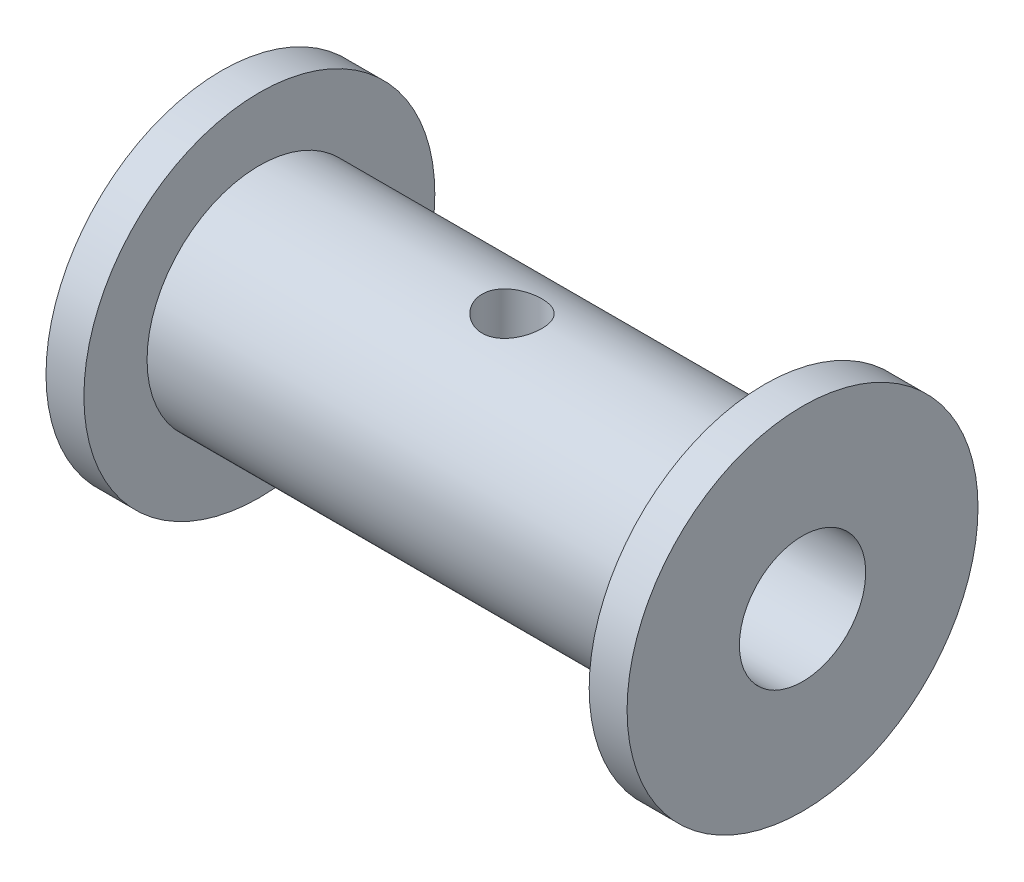
ISO-10303-21;
HEADER;
FILE_DESCRIPTION(('STEP AP214'),'2;1');
FILE_NAME('part.step','',(''),(''),'','','');
FILE_SCHEMA(('AUTOMOTIVE_DESIGN { 1 0 10303 214 1 1 1 1 }'));
ENDSEC;
DATA;
#1=APPLICATION_CONTEXT('core data for automotive mechanical design processes');
#2=APPLICATION_PROTOCOL_DEFINITION('international standard','automotive_design',2000,#1);
#3=PRODUCT_CONTEXT('',#1,'mechanical');
#4=PRODUCT('Part','Part','',(#3));
#5=PRODUCT_RELATED_PRODUCT_CATEGORY('part','',(#4));
#6=PRODUCT_DEFINITION_FORMATION('','',#4);
#7=PRODUCT_DEFINITION_CONTEXT('part definition',#1,'design');
#8=PRODUCT_DEFINITION('design','',#6,#7);
#9=PRODUCT_DEFINITION_SHAPE('','',#8);
#10=(LENGTH_UNIT() NAMED_UNIT(*) SI_UNIT(.MILLI.,.METRE.));
#11=(NAMED_UNIT(*) PLANE_ANGLE_UNIT() SI_UNIT($,.RADIAN.));
#12=(NAMED_UNIT(*) SI_UNIT($,.STERADIAN.) SOLID_ANGLE_UNIT());
#13=UNCERTAINTY_MEASURE_WITH_UNIT(LENGTH_MEASURE(1.E-05),#10,'distance_accuracy_value','');
#14=(GEOMETRIC_REPRESENTATION_CONTEXT(3) GLOBAL_UNCERTAINTY_ASSIGNED_CONTEXT((#13)) GLOBAL_UNIT_ASSIGNED_CONTEXT((#10,
#11,#12)) REPRESENTATION_CONTEXT('',''));
#15=CARTESIAN_POINT('',(0.,0.,0.));
#16=DIRECTION('',(0.,0.,1.));
#17=DIRECTION('',(1.,0.,0.));
#18=AXIS2_PLACEMENT_3D('',#15,#16,#17);
#19=CARTESIAN_POINT('',(-15.2755244755245,0.,0.));
#20=DIRECTION('',(-1.,0.,0.));
#21=DIRECTION('',(0.,0.,1.));
#22=AXIS2_PLACEMENT_3D('',#19,#20,#21);
#23=CYLINDRICAL_SURFACE('',#22,3.175);
#24=CARTESIAN_POINT('',(14.605,0.,0.));
#25=DIRECTION('',(-1.,0.,0.));
#26=DIRECTION('',(0.,0.,1.));
#27=AXIS2_PLACEMENT_3D('',#24,#25,#26);
#28=CIRCLE('',#27,3.175);
#29=CARTESIAN_POINT('',(14.605,0.,3.175));
#30=VERTEX_POINT('',#29);
#31=EDGE_CURVE('E80',#30,#30,#28,.T.);
#32=ORIENTED_EDGE('',*,*,#31,.F.);
#33=EDGE_LOOP('',(#32));
#34=FACE_BOUND('',#33,.T.);
#35=CARTESIAN_POINT('',(-14.605,0.,0.));
#36=DIRECTION('',(-1.,0.,0.));
#37=DIRECTION('',(0.,0.,1.));
#38=AXIS2_PLACEMENT_3D('',#35,#36,#37);
#39=CIRCLE('',#38,3.175);
#40=CARTESIAN_POINT('',(-14.605,0.,3.175));
#41=VERTEX_POINT('',#40);
#42=EDGE_CURVE('E74',#41,#41,#39,.T.);
#43=ORIENTED_EDGE('',*,*,#42,.T.);
#44=EDGE_LOOP('',(#43));
#45=FACE_BOUND('',#44,.T.);
#46=CARTESIAN_POINT('',(0.,2.7983253920872,-1.5));
#47=CARTESIAN_POINT('',(0.0788107476010317,2.79833097649977,-1.49999523547047));
#48=CARTESIAN_POINT('',(0.157735612205732,2.80170427159323,-1.49374832449328));
#49=CARTESIAN_POINT('',(0.313214667514685,2.81472644561665,-1.4690554061353));
#50=CARTESIAN_POINT('',(0.389762907162894,2.82438992585351,-1.45058101361493));
#51=CARTESIAN_POINT('',(0.537952673756733,2.84863009396432,-1.40237253355636));
#52=CARTESIAN_POINT('',(0.609616136431819,2.86318279906116,-1.37269332197988));
#53=CARTESIAN_POINT('',(0.74692939284759,2.89552502377023,-1.30308399064543));
#54=CARTESIAN_POINT('',(0.8125794422789,2.91331440566267,-1.26315430701281));
#55=CARTESIAN_POINT('',(0.941323245258398,2.95172227722859,-1.1707430871524));
#56=CARTESIAN_POINT('',(1.00387788849068,2.97245254188493,-1.11755658650795));
#57=CARTESIAN_POINT('',(1.11959143684936,3.01349951044786,-1.00161259672222));
#58=CARTESIAN_POINT('',(1.17274606260041,3.03381602228766,-0.938850772491945));
#59=CARTESIAN_POINT('',(1.27118937954777,3.07317288716969,-0.801034900704515));
#60=CARTESIAN_POINT('',(1.31583450125175,3.09206866660246,-0.725476017233364));
#61=CARTESIAN_POINT('',(1.39153752206176,3.12503381595021,-0.566861686619154));
#62=CARTESIAN_POINT('',(1.42260309774527,3.13910591174128,-0.483810507023549));
#63=CARTESIAN_POINT('',(1.46819431985617,3.16003750546179,-0.318263833167133));
#64=CARTESIAN_POINT('',(1.4836598006004,3.16730464125021,-0.23607983759682));
#65=CARTESIAN_POINT('',(1.50068669846295,3.17531500926786,-0.0699854874354078));
#66=CARTESIAN_POINT('',(1.50225551712034,3.17606171435844,0.0139239243031286));
#67=CARTESIAN_POINT('',(1.49185310738046,3.1711569999128,0.17410404695592));
#68=CARTESIAN_POINT('',(1.4809263684281,3.16599910390162,0.250460926307549));
#69=CARTESIAN_POINT('',(1.44768451199486,3.15058713309443,0.400106757592313));
#70=CARTESIAN_POINT('',(1.42536854800002,3.14033267949386,0.473395481043944));
#71=CARTESIAN_POINT('',(1.36978180811971,3.11549383971164,0.61616215999247));
#72=CARTESIAN_POINT('',(1.33635400002596,3.10084769916082,0.685567785451937));
#73=CARTESIAN_POINT('',(1.25968096352203,3.06858481389696,0.817962218284119));
#74=CARTESIAN_POINT('',(1.21643213988174,3.05096698193041,0.880948663490016));
#75=CARTESIAN_POINT('',(1.11701776567009,3.01265189942243,1.00453666893054));
#76=CARTESIAN_POINT('',(1.06005736803148,2.9918200943109,1.0644578414785));
#77=CARTESIAN_POINT('',(0.93699705964444,2.95046283361779,1.17424124933889));
#78=CARTESIAN_POINT('',(0.87089145595116,2.92993757775203,1.2240971710571));
#79=CARTESIAN_POINT('',(0.727172138151077,2.89039711066438,1.31484174230845));
#80=CARTESIAN_POINT('',(0.649138941996297,2.87151577260243,1.35512986365461));
#81=CARTESIAN_POINT('',(0.486283743531031,2.83914834140001,1.42170562946273));
#82=CARTESIAN_POINT('',(0.401468219875632,2.82565717160027,1.44800645544408));
#83=CARTESIAN_POINT('',(0.234253704737598,2.80697974613979,1.48387059914899));
#84=CARTESIAN_POINT('',(0.152157558069844,2.80124227464673,1.4945499135996));
#85=CARTESIAN_POINT('',(-0.0128364544628812,2.79714234532468,1.50221328025957));
#86=CARTESIAN_POINT('',(-0.0957338532268694,2.79877582206013,1.49920488189903));
#87=CARTESIAN_POINT('',(-0.25184110118071,2.80865284380239,1.4806017347564));
#88=CARTESIAN_POINT('',(-0.32523813353968,2.81627144126264,1.46619608896935));
#89=CARTESIAN_POINT('',(-0.468463633051388,2.83637948512089,1.42690562153975));
#90=CARTESIAN_POINT('',(-0.538291075738513,2.8488703210638,1.40201781025962));
#91=CARTESIAN_POINT('',(-0.676035807524976,2.87800314814948,1.3412324594274));
#92=CARTESIAN_POINT('',(-0.743715994140066,2.89481019393091,1.30487958898417));
#93=CARTESIAN_POINT('',(-0.872389828600745,2.93050507850425,1.22260967416881));
#94=CARTESIAN_POINT('',(-0.93338011780599,2.94939395301752,1.17668785898318));
#95=CARTESIAN_POINT('',(-1.05395122429284,2.98962533435876,1.07066250220429));
#96=CARTESIAN_POINT('',(-1.11263900919066,3.0110091844446,1.00955462247668));
#97=CARTESIAN_POINT('',(-1.2191662131219,3.05197816465585,0.877952835832725));
#98=CARTESIAN_POINT('',(-1.26700313884629,3.07156288076261,0.807456777596013));
#99=CARTESIAN_POINT('',(-1.35106340432696,3.10717258491727,0.657374049291596));
#100=CARTESIAN_POINT('',(-1.38708244177874,3.12313361565429,0.577656753882327));
#101=CARTESIAN_POINT('',(-1.44486593502356,3.14922093597641,0.412327293299583));
#102=CARTESIAN_POINT('',(-1.46664154231209,3.15935178938716,0.326719797872878));
#103=CARTESIAN_POINT('',(-1.49363889435459,3.17197971044583,0.159896332874223));
#104=CARTESIAN_POINT('',(-1.50011013632642,3.17505233840112,0.078925398284078));
#105=CARTESIAN_POINT('',(-1.49988711965684,3.17494636529876,-0.0829833461657175));
#106=CARTESIAN_POINT('',(-1.49319653511093,3.17176950877122,-0.163921158963004));
#107=CARTESIAN_POINT('',(-1.46770848023088,3.15985410378094,-0.318841842835547));
#108=CARTESIAN_POINT('',(-1.44959197491994,3.15142868675494,-0.392963167600614));
#109=CARTESIAN_POINT('',(-1.40262108547478,3.13010132928976,-0.537026434022491));
#110=CARTESIAN_POINT('',(-1.37376499240882,3.1171986764347,-0.60696770847403));
#111=CARTESIAN_POINT('',(-1.30473490189286,3.08738510301285,-0.744198443618439));
#112=CARTESIAN_POINT('',(-1.26410939390821,3.0703197298679,-0.811226286131094));
#113=CARTESIAN_POINT('',(-1.17328432091972,3.03405477724481,-0.937805412907553));
#114=CARTESIAN_POINT('',(-1.12308040855481,3.01485423033003,-0.997353281796323));
#115=CARTESIAN_POINT('',(-1.00928446778082,2.97425749382228,-1.11287613406119));
#116=CARTESIAN_POINT('',(-0.944896373173603,2.9528185885393,-1.16805442942683));
#117=CARTESIAN_POINT('',(-0.807312145748489,2.91171333700677,-1.26705651381277));
#118=CARTESIAN_POINT('',(-0.734109598744511,2.89204830000693,-1.31087196019013));
#119=CARTESIAN_POINT('',(-0.579232422210802,2.85663554941127,-1.3863737982034));
#120=CARTESIAN_POINT('',(-0.497439352525226,2.84095675906997,-1.41785130272302));
#121=CARTESIAN_POINT('',(-0.328811998329219,2.81635628214136,-1.4661232120466));
#122=CARTESIAN_POINT('',(-0.241995696672077,2.80741192483264,-1.48296690968124));
#123=CARTESIAN_POINT('',(-0.128694633247988,2.80116429672363,-1.49469268672873));
#124=CARTESIAN_POINT('',(-0.10301180774758,2.80010260103933,-1.49668048940514));
#125=CARTESIAN_POINT('',(-0.0515567295081782,2.79868221732461,-1.49933495903092));
#126=CARTESIAN_POINT('',(-0.0257844722890938,2.79832356503778,-1.50000155880871));
#127=CARTESIAN_POINT('',(0.,2.7983253920872,-1.5));
#128=B_SPLINE_CURVE_WITH_KNOTS('',3,(#46,#47,#48,#49,#50,#51,#52,#53,#54,#55,#56,#57,#58,#59,
#60,#61,#62,#63,#64,#65,#66,#67,#68,#69,#70,#71,#72,#73,#74,#75,#76,#77,#78,#79,#80,#81,#82,#83,
#84,#85,#86,#87,#88,#89,#90,#91,#92,#93,#94,#95,#96,#97,#98,#99,#100,#101,#102,#103,#104,#105,
#106,#107,#108,#109,#110,#111,#112,#113,#114,#115,#116,#117,#118,#119,#120,#121,#122,#123,#124,
#125,#126,#127),.UNSPECIFIED.,.T.,.F.,(4,2,2,2,2,2,2,2,2,2,2,2,2,2,2,2,2,2,2,2,2,2,2,2,2,2,2,2,
2,2,2,2,2,2,2,2,2,2,2,2,4),(0.,0.236323871838544,0.473198284289302,0.708927337380699,
0.944646362603916,1.19762429635865,1.45071710395354,1.71864285343498,1.98641694681215,
2.23687152724756,2.48719270436037,2.71802817018661,2.94888079555674,3.1831453100556,
3.41749572162706,3.67216706074964,3.92699765369087,4.19506898546716,4.46288723920479,
4.71043828617548,4.95785281342715,5.18239796950746,5.40700721193729,5.64198832122139,
5.87708686716682,6.13804637958085,6.39906579463174,6.66438519401193,6.92949661955738,
7.17207877892644,7.41459323161728,7.64386670961211,7.87317668624822,8.11282240294707,
8.35257714778319,8.61378861881715,8.87519133270404,9.14084608292566,9.40560248746477,
9.48291651801969,9.56023447921351),.UNSPECIFIED.);
#129=CARTESIAN_POINT('',(0.,2.7983253920872,-1.5));
#130=VERTEX_POINT('',#129);
#131=EDGE_CURVE('E100',#130,#130,#128,.T.);
#132=ORIENTED_EDGE('',*,*,#131,.F.);
#133=EDGE_LOOP('',(#132));
#134=FACE_BOUND('',#133,.T.);
#135=ADVANCED_FACE('F55',(#34,#45,#134),#23,.F.);
#136=CARTESIAN_POINT('',(-15.2755244755245,0.,0.));
#137=DIRECTION('',(-1.,0.,0.));
#138=DIRECTION('',(0.,0.,1.));
#139=AXIS2_PLACEMENT_3D('',#136,#137,#138);
#140=CYLINDRICAL_SURFACE('',#139,5.64515);
#141=CARTESIAN_POINT('',(-12.7,0.,0.));
#142=DIRECTION('',(-1.,0.,0.));
#143=DIRECTION('',(0.,0.,1.));
#144=AXIS2_PLACEMENT_3D('',#141,#142,#143);
#145=CIRCLE('',#144,5.64515);
#146=CARTESIAN_POINT('',(-12.7,0.,5.64515));
#147=VERTEX_POINT('',#146);
#148=EDGE_CURVE('E96',#147,#147,#145,.T.);
#149=ORIENTED_EDGE('',*,*,#148,.F.);
#150=EDGE_LOOP('',(#149));
#151=FACE_BOUND('',#150,.T.);
#152=CARTESIAN_POINT('',(12.7,0.,0.));
#153=DIRECTION('',(-1.,0.,0.));
#154=DIRECTION('',(0.,0.,1.));
#155=AXIS2_PLACEMENT_3D('',#152,#153,#154);
#156=CIRCLE('',#155,5.64515);
#157=CARTESIAN_POINT('',(12.7,0.,5.64515));
#158=VERTEX_POINT('',#157);
#159=EDGE_CURVE('E92',#158,#158,#156,.T.);
#160=ORIENTED_EDGE('',*,*,#159,.T.);
#161=EDGE_LOOP('',(#160));
#162=FACE_BOUND('',#161,.T.);
#163=CARTESIAN_POINT('',(0.,5.44221632448583,-1.5));
#164=CARTESIAN_POINT('',(0.0826436498905731,5.44221776734982,-1.49999798482397));
#165=CARTESIAN_POINT('',(0.16530868542223,5.44411939956257,-1.49314675929322));
#166=CARTESIAN_POINT('',(0.328252175478541,5.45149790283637,-1.46597434045337));
#167=CARTESIAN_POINT('',(0.40852940000449,5.45697658425119,-1.4456463264267));
#168=CARTESIAN_POINT('',(0.564316549846696,5.47084585840447,-1.39223506110244));
#169=CARTESIAN_POINT('',(0.639832974686705,5.4792323749097,-1.35916965804295));
#170=CARTESIAN_POINT('',(0.784258298044925,5.49796717883473,-1.28127804023893));
#171=CARTESIAN_POINT('',(0.853166696174541,5.50831561464326,-1.23645093580583));
#172=CARTESIAN_POINT('',(0.984131351122835,5.53009622169304,-1.13511800376794));
#173=CARTESIAN_POINT('',(1.045999199762,5.54154749766791,-1.0783727299323));
#174=CARTESIAN_POINT('',(1.15946134412678,5.56407856754538,-0.95532926139728));
#175=CARTESIAN_POINT('',(1.21105458106165,5.57515832306535,-0.889030083387623));
#176=CARTESIAN_POINT('',(1.30328774666803,5.59591104111497,-0.747455285881688));
#177=CARTESIAN_POINT('',(1.34374049853005,5.6055588379263,-0.672053715192328));
#178=CARTESIAN_POINT('',(1.41132390215023,5.62214145846994,-0.515220536696469));
#179=CARTESIAN_POINT('',(1.43845678369634,5.62907673624688,-0.433789940796049));
#180=CARTESIAN_POINT('',(1.47802084117912,5.63931781333287,-0.269176674072655));
#181=CARTESIAN_POINT('',(1.4907724800169,5.64270260418738,-0.186076025421636));
#182=CARTESIAN_POINT('',(1.50222017877792,5.64573746281875,-0.0188506571242278));
#183=CARTESIAN_POINT('',(1.50091857507756,5.6453881513968,0.0652738899743704));
#184=CARTESIAN_POINT('',(1.48452268941679,5.64105209399141,0.229928980435986));
#185=CARTESIAN_POINT('',(1.46977462197647,5.63715665623427,0.310496770097809));
#186=CARTESIAN_POINT('',(1.42746360991348,5.62627370326876,0.46797007430665));
#187=CARTESIAN_POINT('',(1.39989993721051,5.61928601238435,0.544875380506924));
#188=CARTESIAN_POINT('',(1.33247392627963,5.60286801449619,0.69372614519827));
#189=CARTESIAN_POINT('',(1.29249269629158,5.5934142425149,0.765615053879316));
#190=CARTESIAN_POINT('',(1.20145768524585,5.57308308647157,0.901781568257522));
#191=CARTESIAN_POINT('',(1.15040175929234,5.56220542679961,0.966057695813074));
#192=CARTESIAN_POINT('',(1.03682773330209,5.53981441387915,1.08724045508485));
#193=CARTESIAN_POINT('',(0.974007640829174,5.52829179055745,1.14386267184279));
#194=CARTESIAN_POINT('',(0.839644289069423,5.50620898724192,1.2458374510173));
#195=CARTESIAN_POINT('',(0.768100506093186,5.49564886509427,1.29118933637082));
#196=CARTESIAN_POINT('',(0.617707356422072,5.47664977453883,1.36955056186863));
#197=CARTESIAN_POINT('',(0.538816186462395,5.46822410361388,1.40248312266783));
#198=CARTESIAN_POINT('',(0.376337254846516,5.45461343650754,1.45452478437216));
#199=CARTESIAN_POINT('',(0.292750653817778,5.44942764329396,1.47363728528923));
#200=CARTESIAN_POINT('',(0.125912172177079,5.44305353995125,1.49700705991464));
#201=CARTESIAN_POINT('',(0.0427239810357125,5.44175115881421,1.50168837778865));
#202=CARTESIAN_POINT('',(-0.1232464577724,5.44297933834186,1.4972307826834));
#203=CARTESIAN_POINT('',(-0.206028747366463,5.44550949438728,1.48809332861816));
#204=CARTESIAN_POINT('',(-0.367207135323571,5.4540075322859,1.45663127836107));
#205=CARTESIAN_POINT('',(-0.445656740300897,5.45990903142662,1.43456112068596));
#206=CARTESIAN_POINT('',(-0.597740886982624,5.47442006116055,1.37814600803546));
#207=CARTESIAN_POINT('',(-0.671374801748043,5.48302994350498,1.34379945858488));
#208=CARTESIAN_POINT('',(-0.813512813620183,5.50222211118877,1.26294408640984));
#209=CARTESIAN_POINT('',(-0.881869725769598,5.51284337226439,1.21618598741617));
#210=CARTESIAN_POINT('',(-1.00992272855403,5.53476961780604,1.11214416757658));
#211=CARTESIAN_POINT('',(-1.06961719942342,5.54607472958491,1.05485848273389));
#212=CARTESIAN_POINT('',(-1.18040859389798,5.56848722620232,0.929427134768067));
#213=CARTESIAN_POINT('',(-1.23120994588551,5.57957964884856,0.861017194964994));
#214=CARTESIAN_POINT('',(-1.32060764860309,5.599984167669,0.716394281042795));
#215=CARTESIAN_POINT('',(-1.3592046487608,5.60929635856387,0.640181722408612));
#216=CARTESIAN_POINT('',(-1.42274469648724,5.62503122537354,0.48265320991643));
#217=CARTESIAN_POINT('',(-1.44778951135348,5.63147537138664,0.40138055252435));
#218=CARTESIAN_POINT('',(-1.48381017839642,5.64084252840109,0.235583544296043));
#219=CARTESIAN_POINT('',(-1.49478912449133,5.64376631372989,0.151059912756287));
#220=CARTESIAN_POINT('',(-1.50217372513024,5.64572704476748,-0.0160774687073766));
#221=CARTESIAN_POINT('',(-1.49901309840769,5.64487967160035,-0.0986709709983087));
#222=CARTESIAN_POINT('',(-1.4792145259925,5.63965460646783,-0.262106269548189));
#223=CARTESIAN_POINT('',(-1.46257707990777,5.63527704537237,-0.342948130629297));
#224=CARTESIAN_POINT('',(-1.41654166905826,5.62350613840027,-0.500067594383635));
#225=CARTESIAN_POINT('',(-1.38723114573617,5.61613347874035,-0.576372469362012));
#226=CARTESIAN_POINT('',(-1.31675972779932,5.59914363493961,-0.723024835745982));
#227=CARTESIAN_POINT('',(-1.27559718045501,5.58952613779831,-0.793371494524248));
#228=CARTESIAN_POINT('',(-1.18131764645405,5.56875793134443,-0.928131965195986));
#229=CARTESIAN_POINT('',(-1.12791269922945,5.5575733380131,-0.992339082223208));
#230=CARTESIAN_POINT('',(-1.01121124142991,5.53506950879546,-1.1110269742205));
#231=CARTESIAN_POINT('',(-0.947912137560949,5.52375023833045,-1.16550519116753));
#232=CARTESIAN_POINT('',(-0.811559656990754,5.50197482997724,-1.2643635861029));
#233=CARTESIAN_POINT('',(-0.738323782610976,5.49154287549226,-1.30849784931156));
#234=CARTESIAN_POINT('',(-0.585203332164704,5.47306373496142,-1.38376439419231));
#235=CARTESIAN_POINT('',(-0.505323175756261,5.46501497964844,-1.41490523720545));
#236=CARTESIAN_POINT('',(-0.354773607905721,5.45333936032317,-1.45919130067615));
#237=CARTESIAN_POINT('',(-0.284760932617647,5.44920182935005,-1.47445878618925));
#238=CARTESIAN_POINT('',(-0.143170736948714,5.44363983861492,-1.49486344059047));
#239=CARTESIAN_POINT('',(-0.0715933929966919,5.44221507454673,-1.50000174572747));
#240=CARTESIAN_POINT('',(0.,5.44221632448583,-1.5));
#241=B_SPLINE_CURVE_WITH_KNOTS('',3,(#163,#164,#165,#166,#167,#168,#169,#170,#171,#172,#173,
#174,#175,#176,#177,#178,#179,#180,#181,#182,#183,#184,#185,#186,#187,#188,#189,#190,#191,#192,
#193,#194,#195,#196,#197,#198,#199,#200,#201,#202,#203,#204,#205,#206,#207,#208,#209,#210,#211,
#212,#213,#214,#215,#216,#217,#218,#219,#220,#221,#222,#223,#224,#225,#226,#227,#228,#229,#230,
#231,#232,#233,#234,#235,#236,#237,#238,#239,#240),.UNSPECIFIED.,.T.,.F.,(4,2,2,2,2,2,2,2,2,2,2,
2,2,2,2,2,2,2,2,2,2,2,2,2,2,2,2,2,2,2,2,2,2,2,2,2,2,2,4),(0.,0.247667710125486,
0.495460862778318,0.742908051487609,0.990373963205123,1.24339169248411,1.49643548156669,
1.75350218310325,2.01052583618261,2.26170139841543,2.51283520291044,2.75768007782892,
3.00253886457703,3.24981834681255,3.49714576382274,3.75201343494891,4.00689641350378,
4.26333027004574,4.51970101723072,4.76846310534649,5.01719893228946,5.26119804243582,
5.50522885505554,5.75459010240262,6.00399791719429,6.26055652250194,6.51710147331073,
6.77169223310905,7.02622698369015,7.27300855695848,7.51978098204571,7.76487724343747,
8.010007699341,8.26163597667072,8.51333031761168,8.77050932101105,9.02751860100832,
9.24209480975804,9.45664694688028),.UNSPECIFIED.);
#242=CARTESIAN_POINT('',(0.,5.44221632448583,-1.5));
#243=VERTEX_POINT('',#242);
#244=EDGE_CURVE('E59',#243,#243,#241,.T.);
#245=ORIENTED_EDGE('',*,*,#244,.T.);
#246=EDGE_LOOP('',(#245));
#247=FACE_BOUND('',#246,.T.);
#248=ADVANCED_FACE('F115',(#151,#162,#247),#140,.T.);
#249=CARTESIAN_POINT('',(-12.7,0.,0.));
#250=DIRECTION('',(1.,0.,0.));
#251=DIRECTION('',(0.,0.,-1.));
#252=AXIS2_PLACEMENT_3D('',#249,#250,#251);
#253=PLANE('',#252);
#254=ORIENTED_EDGE('',*,*,#148,.T.);
#255=EDGE_LOOP('',(#254));
#256=FACE_BOUND('',#255,.T.);
#257=CARTESIAN_POINT('',(-12.7,0.,0.));
#258=DIRECTION('',(-1.,0.,0.));
#259=DIRECTION('',(0.,0.,1.));
#260=AXIS2_PLACEMENT_3D('',#257,#258,#259);
#261=CIRCLE('',#260,8.82015);
#262=CARTESIAN_POINT('',(-12.7,0.,8.82015));
#263=VERTEX_POINT('',#262);
#264=EDGE_CURVE('E10',#263,#263,#261,.T.);
#265=ORIENTED_EDGE('',*,*,#264,.F.);
#266=EDGE_LOOP('',(#265));
#267=FACE_BOUND('',#266,.T.);
#268=ADVANCED_FACE('F57',(#256,#267),#253,.T.);
#269=CARTESIAN_POINT('',(-15.2755244755245,0.,0.));
#270=DIRECTION('',(-1.,0.,0.));
#271=DIRECTION('',(0.,0.,1.));
#272=AXIS2_PLACEMENT_3D('',#269,#270,#271);
#273=CYLINDRICAL_SURFACE('',#272,8.82015);
#274=ORIENTED_EDGE('',*,*,#264,.T.);
#275=EDGE_LOOP('',(#274));
#276=FACE_BOUND('',#275,.T.);
#277=CARTESIAN_POINT('',(-14.605,0.,0.));
#278=DIRECTION('',(-1.,0.,0.));
#279=DIRECTION('',(0.,0.,1.));
#280=AXIS2_PLACEMENT_3D('',#277,#278,#279);
#281=CIRCLE('',#280,8.82015);
#282=CARTESIAN_POINT('',(-14.605,0.,8.82015));
#283=VERTEX_POINT('',#282);
#284=EDGE_CURVE('E69',#283,#283,#281,.T.);
#285=ORIENTED_EDGE('',*,*,#284,.F.);
#286=EDGE_LOOP('',(#285));
#287=FACE_BOUND('',#286,.T.);
#288=ADVANCED_FACE('F134',(#276,#287),#273,.T.);
#289=CARTESIAN_POINT('',(-14.605,0.,0.));
#290=DIRECTION('',(1.,0.,0.));
#291=DIRECTION('',(0.,0.,-1.));
#292=AXIS2_PLACEMENT_3D('',#289,#290,#291);
#293=PLANE('',#292);
#294=ORIENTED_EDGE('',*,*,#42,.F.);
#295=EDGE_LOOP('',(#294));
#296=FACE_BOUND('',#295,.T.);
#297=ORIENTED_EDGE('',*,*,#284,.T.);
#298=EDGE_LOOP('',(#297));
#299=FACE_BOUND('',#298,.T.);
#300=ADVANCED_FACE('F129',(#296,#299),#293,.F.);
#301=CARTESIAN_POINT('',(14.605,0.,0.));
#302=DIRECTION('',(1.,0.,0.));
#303=DIRECTION('',(0.,0.,-1.));
#304=AXIS2_PLACEMENT_3D('',#301,#302,#303);
#305=PLANE('',#304);
#306=ORIENTED_EDGE('',*,*,#31,.T.);
#307=EDGE_LOOP('',(#306));
#308=FACE_BOUND('',#307,.T.);
#309=CARTESIAN_POINT('',(14.605,0.,0.));
#310=DIRECTION('',(-1.,0.,0.));
#311=DIRECTION('',(0.,0.,1.));
#312=AXIS2_PLACEMENT_3D('',#309,#310,#311);
#313=CIRCLE('',#312,8.82015);
#314=CARTESIAN_POINT('',(14.605,0.,8.82015));
#315=VERTEX_POINT('',#314);
#316=EDGE_CURVE('E84',#315,#315,#313,.T.);
#317=ORIENTED_EDGE('',*,*,#316,.F.);
#318=EDGE_LOOP('',(#317));
#319=FACE_BOUND('',#318,.T.);
#320=ADVANCED_FACE('F126',(#308,#319),#305,.T.);
#321=CARTESIAN_POINT('',(-15.2755244755245,0.,0.));
#322=DIRECTION('',(-1.,0.,0.));
#323=DIRECTION('',(0.,0.,1.));
#324=AXIS2_PLACEMENT_3D('',#321,#322,#323);
#325=CYLINDRICAL_SURFACE('',#324,8.82015);
#326=CARTESIAN_POINT('',(12.7,0.,0.));
#327=DIRECTION('',(-1.,0.,0.));
#328=DIRECTION('',(0.,0.,1.));
#329=AXIS2_PLACEMENT_3D('',#326,#327,#328);
#330=CIRCLE('',#329,8.82015);
#331=CARTESIAN_POINT('',(12.7,0.,8.82015));
#332=VERTEX_POINT('',#331);
#333=EDGE_CURVE('E88',#332,#332,#330,.T.);
#334=ORIENTED_EDGE('',*,*,#333,.F.);
#335=EDGE_LOOP('',(#334));
#336=FACE_BOUND('',#335,.T.);
#337=ORIENTED_EDGE('',*,*,#316,.T.);
#338=EDGE_LOOP('',(#337));
#339=FACE_BOUND('',#338,.T.);
#340=ADVANCED_FACE('F123',(#336,#339),#325,.T.);
#341=CARTESIAN_POINT('',(12.7,0.,0.));
#342=DIRECTION('',(1.,0.,0.));
#343=DIRECTION('',(0.,0.,-1.));
#344=AXIS2_PLACEMENT_3D('',#341,#342,#343);
#345=PLANE('',#344);
#346=ORIENTED_EDGE('',*,*,#159,.F.);
#347=EDGE_LOOP('',(#346));
#348=FACE_BOUND('',#347,.T.);
#349=ORIENTED_EDGE('',*,*,#333,.T.);
#350=EDGE_LOOP('',(#349));
#351=FACE_BOUND('',#350,.T.);
#352=ADVANCED_FACE('F113',(#348,#351),#345,.F.);
#353=CARTESIAN_POINT('',(0.,8.82015,0.));
#354=DIRECTION('',(0.,-1.,0.));
#355=DIRECTION('',(0.,0.,-1.));
#356=AXIS2_PLACEMENT_3D('',#353,#354,#355);
#357=CYLINDRICAL_SURFACE('',#356,1.5);
#358=ORIENTED_EDGE('',*,*,#244,.F.);
#359=EDGE_LOOP('',(#358));
#360=FACE_BOUND('',#359,.T.);
#361=ORIENTED_EDGE('',*,*,#131,.T.);
#362=EDGE_LOOP('',(#361));
#363=FACE_BOUND('',#362,.T.);
#364=ADVANCED_FACE('F110',(#360,#363),#357,.F.);
#365=CLOSED_SHELL('',(#135,#248,#268,#288,#300,#320,#340,#352,#364));
#366=MANIFOLD_SOLID_BREP('B2',#365);
#367=ADVANCED_BREP_SHAPE_REPRESENTATION('',(#18,#366),#14);
#368=SHAPE_DEFINITION_REPRESENTATION(#9,#367);
ENDSEC;
END-ISO-10303-21;
